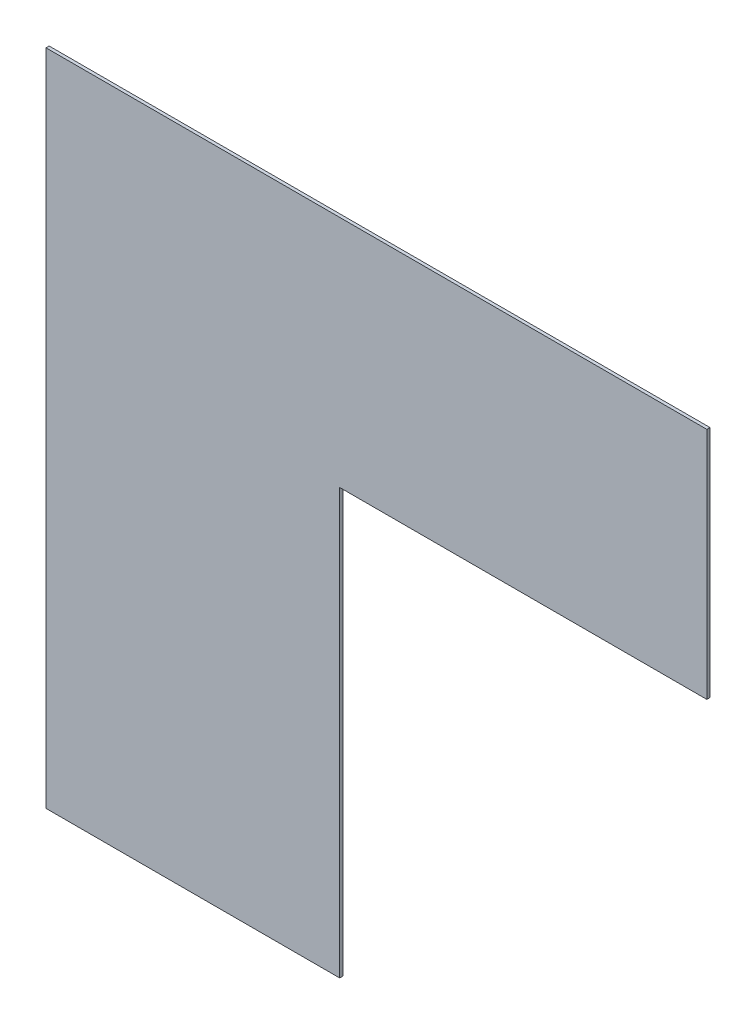
ISO-10303-21;
HEADER;
FILE_DESCRIPTION(('STEP AP214'),'2;1');
FILE_NAME('part.step','',(''),(''),'','','');
FILE_SCHEMA(('AUTOMOTIVE_DESIGN { 1 0 10303 214 1 1 1 1 }'));
ENDSEC;
DATA;
#1=APPLICATION_CONTEXT('core data for automotive mechanical design processes');
#2=APPLICATION_PROTOCOL_DEFINITION('international standard','automotive_design',2000,#1);
#3=PRODUCT_CONTEXT('',#1,'mechanical');
#4=PRODUCT('Part','Part','',(#3));
#5=PRODUCT_RELATED_PRODUCT_CATEGORY('part','',(#4));
#6=PRODUCT_DEFINITION_FORMATION('','',#4);
#7=PRODUCT_DEFINITION_CONTEXT('part definition',#1,'design');
#8=PRODUCT_DEFINITION('design','',#6,#7);
#9=PRODUCT_DEFINITION_SHAPE('','',#8);
#10=(LENGTH_UNIT() NAMED_UNIT(*) SI_UNIT(.MILLI.,.METRE.));
#11=(NAMED_UNIT(*) PLANE_ANGLE_UNIT() SI_UNIT($,.RADIAN.));
#12=(NAMED_UNIT(*) SI_UNIT($,.STERADIAN.) SOLID_ANGLE_UNIT());
#13=UNCERTAINTY_MEASURE_WITH_UNIT(LENGTH_MEASURE(1.E-05),#10,'distance_accuracy_value','');
#14=(GEOMETRIC_REPRESENTATION_CONTEXT(3) GLOBAL_UNCERTAINTY_ASSIGNED_CONTEXT((#13)) GLOBAL_UNIT_ASSIGNED_CONTEXT((#10,
#11,#12)) REPRESENTATION_CONTEXT('',''));
#15=CARTESIAN_POINT('',(0.,0.,0.));
#16=DIRECTION('',(0.,0.,1.));
#17=DIRECTION('',(1.,0.,0.));
#18=AXIS2_PLACEMENT_3D('',#15,#16,#17);
#19=CARTESIAN_POINT('',(350.,628.,3.));
#20=DIRECTION('',(-1.,0.,0.));
#21=DIRECTION('',(0.,-1.,0.));
#22=AXIS2_PLACEMENT_3D('',#19,#20,#21);
#23=PLANE('',#22);
#24=DIRECTION('',(0.,1.,0.));
#25=VECTOR('',#24,1.);
#26=CARTESIAN_POINT('',(350.,628.,0.));
#27=LINE('',#26,#25);
#28=CARTESIAN_POINT('',(350.,405.,0.));
#29=VERTEX_POINT('',#28);
#30=CARTESIAN_POINT('',(350.,628.,0.));
#31=VERTEX_POINT('',#30);
#32=EDGE_CURVE('E117',#29,#31,#27,.T.);
#33=ORIENTED_EDGE('',*,*,#32,.T.);
#34=DIRECTION('',(0.,0.,-1.));
#35=VECTOR('',#34,1.);
#36=CARTESIAN_POINT('',(350.,628.,3.));
#37=LINE('',#36,#35);
#38=CARTESIAN_POINT('',(350.,628.,3.));
#39=VERTEX_POINT('',#38);
#40=EDGE_CURVE('E11',#39,#31,#37,.T.);
#41=ORIENTED_EDGE('',*,*,#40,.F.);
#42=DIRECTION('',(0.,1.,0.));
#43=VECTOR('',#42,1.);
#44=CARTESIAN_POINT('',(350.,628.,3.));
#45=LINE('',#44,#43);
#46=CARTESIAN_POINT('',(350.,405.,3.));
#47=VERTEX_POINT('',#46);
#48=EDGE_CURVE('E127',#47,#39,#45,.T.);
#49=ORIENTED_EDGE('',*,*,#48,.F.);
#50=DIRECTION('',(0.,0.,-1.));
#51=VECTOR('',#50,1.);
#52=CARTESIAN_POINT('',(350.,405.,3.));
#53=LINE('',#52,#51);
#54=EDGE_CURVE('E113',#47,#29,#53,.T.);
#55=ORIENTED_EDGE('',*,*,#54,.T.);
#56=EDGE_LOOP('',(#33,#41,#49,#55));
#57=FACE_BOUND('',#56,.T.);
#58=ADVANCED_FACE('F33',(#57),#23,.F.);
#59=CARTESIAN_POINT('',(350.,628.,3.));
#60=DIRECTION('',(0.,-1.,0.));
#61=DIRECTION('',(0.,0.,-1.));
#62=AXIS2_PLACEMENT_3D('',#59,#60,#61);
#63=PLANE('',#62);
#64=DIRECTION('',(-1.,0.,0.));
#65=VECTOR('',#64,1.);
#66=CARTESIAN_POINT('',(350.,628.,0.));
#67=LINE('',#66,#65);
#68=CARTESIAN_POINT('',(-280.,628.,0.));
#69=VERTEX_POINT('',#68);
#70=EDGE_CURVE('E120',#31,#69,#67,.T.);
#71=ORIENTED_EDGE('',*,*,#70,.T.);
#72=DIRECTION('',(0.,0.,-1.));
#73=VECTOR('',#72,1.);
#74=CARTESIAN_POINT('',(-280.,628.,3.));
#75=LINE('',#74,#73);
#76=CARTESIAN_POINT('',(-280.,628.,3.));
#77=VERTEX_POINT('',#76);
#78=EDGE_CURVE('E41',#77,#69,#75,.T.);
#79=ORIENTED_EDGE('',*,*,#78,.F.);
#80=DIRECTION('',(-1.,0.,0.));
#81=VECTOR('',#80,1.);
#82=CARTESIAN_POINT('',(350.,628.,3.));
#83=LINE('',#82,#81);
#84=EDGE_CURVE('E86',#39,#77,#83,.T.);
#85=ORIENTED_EDGE('',*,*,#84,.F.);
#86=ORIENTED_EDGE('',*,*,#40,.T.);
#87=EDGE_LOOP('',(#71,#79,#85,#86));
#88=FACE_BOUND('',#87,.T.);
#89=ADVANCED_FACE('F151',(#88),#63,.F.);
#90=CARTESIAN_POINT('',(-280.,628.,3.));
#91=DIRECTION('',(1.,0.,0.));
#92=DIRECTION('',(0.,0.,-1.));
#93=AXIS2_PLACEMENT_3D('',#90,#91,#92);
#94=PLANE('',#93);
#95=DIRECTION('',(0.,-1.,0.));
#96=VECTOR('',#95,1.);
#97=CARTESIAN_POINT('',(-280.,628.,0.));
#98=LINE('',#97,#96);
#99=CARTESIAN_POINT('',(-280.,0.,0.));
#100=VERTEX_POINT('',#99);
#101=EDGE_CURVE('E122',#69,#100,#98,.T.);
#102=ORIENTED_EDGE('',*,*,#101,.T.);
#103=DIRECTION('',(0.,0.,-1.));
#104=VECTOR('',#103,1.);
#105=CARTESIAN_POINT('',(-280.,0.,3.));
#106=LINE('',#105,#104);
#107=CARTESIAN_POINT('',(-280.,0.,3.));
#108=VERTEX_POINT('',#107);
#109=EDGE_CURVE('E108',#108,#100,#106,.T.);
#110=ORIENTED_EDGE('',*,*,#109,.F.);
#111=DIRECTION('',(0.,-1.,0.));
#112=VECTOR('',#111,1.);
#113=CARTESIAN_POINT('',(-280.,628.,3.));
#114=LINE('',#113,#112);
#115=EDGE_CURVE('E99',#77,#108,#114,.T.);
#116=ORIENTED_EDGE('',*,*,#115,.F.);
#117=ORIENTED_EDGE('',*,*,#78,.T.);
#118=EDGE_LOOP('',(#102,#110,#116,#117));
#119=FACE_BOUND('',#118,.T.);
#120=ADVANCED_FACE('F133',(#119),#94,.F.);
#121=CARTESIAN_POINT('',(0.,0.,3.));
#122=DIRECTION('',(0.,1.,0.));
#123=DIRECTION('',(-1.,0.,0.));
#124=AXIS2_PLACEMENT_3D('',#121,#122,#123);
#125=PLANE('',#124);
#126=DIRECTION('',(1.,0.,0.));
#127=VECTOR('',#126,1.);
#128=CARTESIAN_POINT('',(0.,0.,0.));
#129=LINE('',#128,#127);
#130=CARTESIAN_POINT('',(0.,0.,0.));
#131=VERTEX_POINT('',#130);
#132=EDGE_CURVE('E107',#100,#131,#129,.T.);
#133=ORIENTED_EDGE('',*,*,#132,.T.);
#134=DIRECTION('',(0.,0.,-1.));
#135=VECTOR('',#134,1.);
#136=CARTESIAN_POINT('',(0.,0.,3.));
#137=LINE('',#136,#135);
#138=CARTESIAN_POINT('',(0.,0.,3.));
#139=VERTEX_POINT('',#138);
#140=EDGE_CURVE('E104',#139,#131,#137,.T.);
#141=ORIENTED_EDGE('',*,*,#140,.F.);
#142=DIRECTION('',(1.,0.,0.));
#143=VECTOR('',#142,1.);
#144=CARTESIAN_POINT('',(0.,0.,3.));
#145=LINE('',#144,#143);
#146=EDGE_CURVE('E93',#108,#139,#145,.T.);
#147=ORIENTED_EDGE('',*,*,#146,.F.);
#148=ORIENTED_EDGE('',*,*,#109,.T.);
#149=EDGE_LOOP('',(#133,#141,#147,#148));
#150=FACE_BOUND('',#149,.T.);
#151=ADVANCED_FACE('F105',(#150),#125,.F.);
#152=CARTESIAN_POINT('',(0.,0.,3.));
#153=DIRECTION('',(-1.,0.,0.));
#154=DIRECTION('',(0.,-1.,0.));
#155=AXIS2_PLACEMENT_3D('',#152,#153,#154);
#156=PLANE('',#155);
#157=DIRECTION('',(0.,1.,0.));
#158=VECTOR('',#157,1.);
#159=CARTESIAN_POINT('',(0.,0.,0.));
#160=LINE('',#159,#158);
#161=CARTESIAN_POINT('',(0.,405.,0.));
#162=VERTEX_POINT('',#161);
#163=EDGE_CURVE('E72',#131,#162,#160,.T.);
#164=ORIENTED_EDGE('',*,*,#163,.T.);
#165=DIRECTION('',(0.,0.,-1.));
#166=VECTOR('',#165,1.);
#167=CARTESIAN_POINT('',(0.,405.,3.));
#168=LINE('',#167,#166);
#169=CARTESIAN_POINT('',(0.,405.,3.));
#170=VERTEX_POINT('',#169);
#171=EDGE_CURVE('E109',#170,#162,#168,.T.);
#172=ORIENTED_EDGE('',*,*,#171,.F.);
#173=DIRECTION('',(0.,1.,0.));
#174=VECTOR('',#173,1.);
#175=CARTESIAN_POINT('',(0.,0.,3.));
#176=LINE('',#175,#174);
#177=EDGE_CURVE('E97',#139,#170,#176,.T.);
#178=ORIENTED_EDGE('',*,*,#177,.F.);
#179=ORIENTED_EDGE('',*,*,#140,.T.);
#180=EDGE_LOOP('',(#164,#172,#178,#179));
#181=FACE_BOUND('',#180,.T.);
#182=ADVANCED_FACE('F111',(#181),#156,.F.);
#183=CARTESIAN_POINT('',(0.,405.,3.));
#184=DIRECTION('',(0.,1.,0.));
#185=DIRECTION('',(-1.,0.,0.));
#186=AXIS2_PLACEMENT_3D('',#183,#184,#185);
#187=PLANE('',#186);
#188=DIRECTION('',(1.,0.,0.));
#189=VECTOR('',#188,1.);
#190=CARTESIAN_POINT('',(0.,405.,0.));
#191=LINE('',#190,#189);
#192=EDGE_CURVE('E78',#162,#29,#191,.T.);
#193=ORIENTED_EDGE('',*,*,#192,.T.);
#194=ORIENTED_EDGE('',*,*,#54,.F.);
#195=DIRECTION('',(1.,0.,0.));
#196=VECTOR('',#195,1.);
#197=CARTESIAN_POINT('',(0.,405.,3.));
#198=LINE('',#197,#196);
#199=EDGE_CURVE('E49',#170,#47,#198,.T.);
#200=ORIENTED_EDGE('',*,*,#199,.F.);
#201=ORIENTED_EDGE('',*,*,#171,.T.);
#202=EDGE_LOOP('',(#193,#194,#200,#201));
#203=FACE_BOUND('',#202,.T.);
#204=ADVANCED_FACE('F140',(#203),#187,.F.);
#205=CARTESIAN_POINT('',(0.,0.,3.));
#206=DIRECTION('',(0.,0.,1.));
#207=DIRECTION('',(1.,0.,0.));
#208=AXIS2_PLACEMENT_3D('',#205,#206,#207);
#209=PLANE('',#208);
#210=ORIENTED_EDGE('',*,*,#48,.T.);
#211=ORIENTED_EDGE('',*,*,#84,.T.);
#212=ORIENTED_EDGE('',*,*,#115,.T.);
#213=ORIENTED_EDGE('',*,*,#146,.T.);
#214=ORIENTED_EDGE('',*,*,#177,.T.);
#215=ORIENTED_EDGE('',*,*,#199,.T.);
#216=EDGE_LOOP('',(#210,#211,#212,#213,#214,#215));
#217=FACE_BOUND('',#216,.T.);
#218=ADVANCED_FACE('F95',(#217),#209,.T.);
#219=CARTESIAN_POINT('',(0.,0.,0.));
#220=DIRECTION('',(0.,0.,1.));
#221=DIRECTION('',(1.,0.,0.));
#222=AXIS2_PLACEMENT_3D('',#219,#220,#221);
#223=PLANE('',#222);
#224=ORIENTED_EDGE('',*,*,#32,.F.);
#225=ORIENTED_EDGE('',*,*,#192,.F.);
#226=ORIENTED_EDGE('',*,*,#163,.F.);
#227=ORIENTED_EDGE('',*,*,#132,.F.);
#228=ORIENTED_EDGE('',*,*,#101,.F.);
#229=ORIENTED_EDGE('',*,*,#70,.F.);
#230=EDGE_LOOP('',(#224,#225,#226,#227,#228,#229));
#231=FACE_BOUND('',#230,.T.);
#232=ADVANCED_FACE('F136',(#231),#223,.F.);
#233=CLOSED_SHELL('',(#58,#89,#120,#151,#182,#204,#218,#232));
#234=MANIFOLD_SOLID_BREP('B2',#233);
#235=ADVANCED_BREP_SHAPE_REPRESENTATION('',(#18,#234),#14);
#236=SHAPE_DEFINITION_REPRESENTATION(#9,#235);
ENDSEC;
END-ISO-10303-21;
